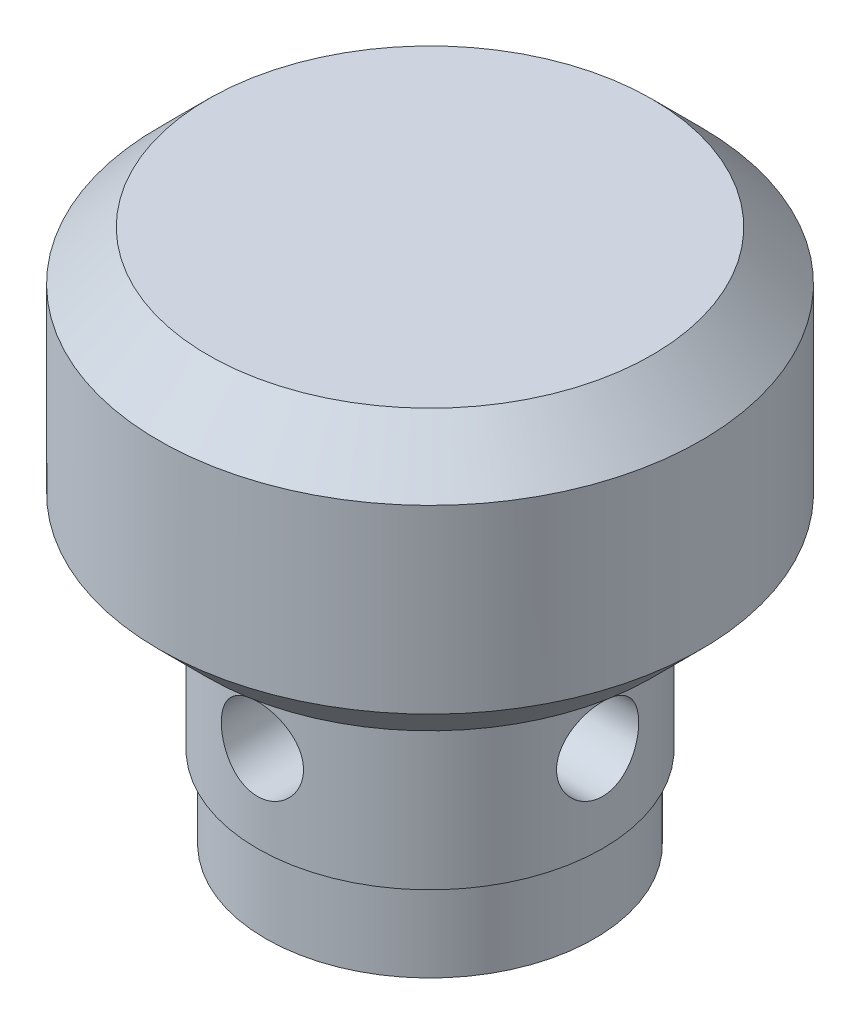
ISO-10303-21;
HEADER;
FILE_DESCRIPTION(('STEP AP214'),'2;1');
FILE_NAME('part.step','',(''),(''),'','','');
FILE_SCHEMA(('AUTOMOTIVE_DESIGN { 1 0 10303 214 1 1 1 1 }'));
ENDSEC;
DATA;
#1=APPLICATION_CONTEXT('core data for automotive mechanical design processes');
#2=APPLICATION_PROTOCOL_DEFINITION('international standard','automotive_design',2000,#1);
#3=PRODUCT_CONTEXT('',#1,'mechanical');
#4=PRODUCT('Part','Part','',(#3));
#5=PRODUCT_RELATED_PRODUCT_CATEGORY('part','',(#4));
#6=PRODUCT_DEFINITION_FORMATION('','',#4);
#7=PRODUCT_DEFINITION_CONTEXT('part definition',#1,'design');
#8=PRODUCT_DEFINITION('design','',#6,#7);
#9=PRODUCT_DEFINITION_SHAPE('','',#8);
#10=(LENGTH_UNIT() NAMED_UNIT(*) SI_UNIT(.MILLI.,.METRE.));
#11=(NAMED_UNIT(*) PLANE_ANGLE_UNIT() SI_UNIT($,.RADIAN.));
#12=(NAMED_UNIT(*) SI_UNIT($,.STERADIAN.) SOLID_ANGLE_UNIT());
#13=UNCERTAINTY_MEASURE_WITH_UNIT(LENGTH_MEASURE(1.E-05),#10,'distance_accuracy_value','');
#14=(GEOMETRIC_REPRESENTATION_CONTEXT(3) GLOBAL_UNCERTAINTY_ASSIGNED_CONTEXT((#13)) GLOBAL_UNIT_ASSIGNED_CONTEXT((#10,
#11,#12)) REPRESENTATION_CONTEXT('',''));
#15=CARTESIAN_POINT('',(0.,0.,0.));
#16=DIRECTION('',(0.,0.,1.));
#17=DIRECTION('',(1.,0.,0.));
#18=AXIS2_PLACEMENT_3D('',#15,#16,#17);
#19=CARTESIAN_POINT('',(0.,0.,0.));
#20=DIRECTION('',(0.,1.,0.));
#21=DIRECTION('',(0.,0.,1.));
#22=AXIS2_PLACEMENT_3D('',#19,#20,#21);
#23=PLANE('',#22);
#24=CARTESIAN_POINT('',(1.10727272727273,0.,-1.90909090909092));
#25=DIRECTION('',(0.,-1.,0.));
#26=DIRECTION('',(0.,0.,-1.));
#27=AXIS2_PLACEMENT_3D('',#24,#25,#26);
#28=CIRCLE('',#27,10.);
#29=CARTESIAN_POINT('',(1.10727272727273,0.,-11.9090909090909));
#30=VERTEX_POINT('',#29);
#31=EDGE_CURVE('E11',#30,#30,#28,.T.);
#32=ORIENTED_EDGE('',*,*,#31,.F.);
#33=EDGE_LOOP('',(#32));
#34=FACE_BOUND('',#33,.T.);
#35=CARTESIAN_POINT('',(1.10727272727273,0.,-1.90909090909092));
#36=DIRECTION('',(0.,1.,0.));
#37=DIRECTION('',(0.,0.,1.));
#38=AXIS2_PLACEMENT_3D('',#35,#36,#37);
#39=CIRCLE('',#38,10.5);
#40=CARTESIAN_POINT('',(1.10727272727273,0.,8.59090909090908));
#41=VERTEX_POINT('',#40);
#42=EDGE_CURVE('E170',#41,#41,#39,.T.);
#43=ORIENTED_EDGE('',*,*,#42,.F.);
#44=EDGE_LOOP('',(#43));
#45=FACE_BOUND('',#44,.T.);
#46=ADVANCED_FACE('F34',(#34,#45),#23,.F.);
#47=CARTESIAN_POINT('',(1.10727272727273,5.25,-15.9090909090909));
#48=DIRECTION('',(0.,0.,1.));
#49=DIRECTION('',(1.,0.,0.));
#50=AXIS2_PLACEMENT_3D('',#47,#48,#49);
#51=CYLINDRICAL_SURFACE('',#50,2.5);
#52=CARTESIAN_POINT('',(1.10727272727273,5.25,-1.90909090909092));
#53=DIRECTION('',(-0.707106781186547,0.,0.707106781186547));
#54=DIRECTION('',(0.707106781186547,0.,0.707106781186547));
#55=AXIS2_PLACEMENT_3D('',#52,#53,#54);
#56=ELLIPSE('',#55,3.53553390593274,2.5);
#57=CARTESIAN_POINT('',(1.10727272727273,7.75,-1.90909090909092));
#58=VERTEX_POINT('',#57);
#59=CARTESIAN_POINT('',(2.8750396802391,3.48223304703363,-0.141323956124547));
#60=VERTEX_POINT('',#59);
#61=EDGE_CURVE('E86',#58,#60,#56,.F.);
#62=ORIENTED_EDGE('',*,*,#61,.T.);
#63=CARTESIAN_POINT('',(1.10727272727273,5.25,-1.90909090909092));
#64=DIRECTION('',(0.,0.707106781186547,0.707106781186547));
#65=DIRECTION('',(0.,-0.707106781186547,0.707106781186547));
#66=AXIS2_PLACEMENT_3D('',#63,#64,#65);
#67=ELLIPSE('',#66,3.53553390593274,2.5);
#68=CARTESIAN_POINT('',(-0.660494225693643,3.48223304703363,-0.141323956124547));
#69=VERTEX_POINT('',#68);
#70=EDGE_CURVE('E50',#60,#69,#67,.F.);
#71=ORIENTED_EDGE('',*,*,#70,.T.);
#72=CARTESIAN_POINT('',(1.10727272727273,5.25,-1.90909090909092));
#73=DIRECTION('',(0.707106781186547,0.,0.707106781186547));
#74=DIRECTION('',(-0.707106781186547,0.,0.707106781186547));
#75=AXIS2_PLACEMENT_3D('',#72,#73,#74);
#76=ELLIPSE('',#75,3.53553390593274,2.5);
#77=EDGE_CURVE('E57',#69,#58,#76,.F.);
#78=ORIENTED_EDGE('',*,*,#77,.T.);
#79=EDGE_LOOP('',(#62,#71,#78));
#80=FACE_BOUND('',#79,.T.);
#81=CARTESIAN_POINT('',(1.10727272727273,7.75,8.59090909090908));
#82=CARTESIAN_POINT('',(1.24545276969234,7.74999304002521,8.59090520188962));
#83=CARTESIAN_POINT('',(1.38379765625235,7.73849338058383,8.58815102276378));
#84=CARTESIAN_POINT('',(1.65665655177706,7.69282235918726,8.57741980260843));
#85=CARTESIAN_POINT('',(1.79116273989071,7.65860774049447,8.56943279694204));
#86=CARTESIAN_POINT('',(2.05218387770887,7.56865434806554,8.54912359354954));
#87=CARTESIAN_POINT('',(2.17871153013522,7.5129508480802,8.536808503257));
#88=CARTESIAN_POINT('',(2.42058336346318,7.3817015965446,8.50916482801384));
#89=CARTESIAN_POINT('',(2.53593062628848,7.30616133450388,8.49383707706402));
#90=CARTESIAN_POINT('',(2.75439919018182,7.13586300980744,8.46151124578841));
#91=CARTESIAN_POINT('',(2.85727941302636,7.0408001772292,8.44448920659301));
#92=CARTESIAN_POINT('',(3.04580194081693,6.83480390511333,8.41085559593251));
#93=CARTESIAN_POINT('',(3.13144152924257,6.72386796923391,8.39424408951416));
#94=CARTESIAN_POINT('',(3.28414189177027,6.48745704404985,8.36307606961005));
#95=CARTESIAN_POINT('',(3.35094036031321,6.36180827626745,8.348549832948));
#96=CARTESIAN_POINT('',(3.46237639131847,6.1006653055624,8.32354171402451));
#97=CARTESIAN_POINT('',(3.50701731440505,5.96517259924094,8.31305921850456));
#98=CARTESIAN_POINT('',(3.57206509617649,5.69080620111243,8.29756901614652));
#99=CARTESIAN_POINT('',(3.59289991832407,5.552039546202,8.29246475958853));
#100=CARTESIAN_POINT('',(3.61107620490725,5.27289368396075,8.28801959431932));
#101=CARTESIAN_POINT('',(3.60842108585323,5.13251471410029,8.28867784747583));
#102=CARTESIAN_POINT('',(3.58003553336417,4.8573708098123,8.29559627423961));
#103=CARTESIAN_POINT('',(3.55481009468411,4.72255021833167,8.30173384536311));
#104=CARTESIAN_POINT('',(3.4828030418247,4.45911062358124,8.31872465730834));
#105=CARTESIAN_POINT('',(3.4360198724614,4.3304920684686,8.32957823834183));
#106=CARTESIAN_POINT('',(3.32178038124929,4.0817250195944,8.35489430310446));
#107=CARTESIAN_POINT('',(3.25413590374933,3.96166638959504,8.36938940085652));
#108=CARTESIAN_POINT('',(3.10023072353306,3.73442907232009,8.40033495597346));
#109=CARTESIAN_POINT('',(3.01396832155568,3.62725156209747,8.41678559175901));
#110=CARTESIAN_POINT('',(2.82265369147607,3.42592763687392,8.4503067348457));
#111=CARTESIAN_POINT('',(2.7171770347683,3.33218498301948,8.46738233066638));
#112=CARTESIAN_POINT('',(2.49174965557243,3.16360710362831,8.49985576501045));
#113=CARTESIAN_POINT('',(2.37179271665111,3.0887800415762,8.5152528775186));
#114=CARTESIAN_POINT('',(2.12023348001323,2.96003115061365,8.54270195971719));
#115=CARTESIAN_POINT('',(1.98859034100088,2.9061864909642,8.55474153573935));
#116=CARTESIAN_POINT('',(1.71793467371349,2.82160257063129,8.57400953315034));
#117=CARTESIAN_POINT('',(1.57893818100403,2.79081508584319,8.58124799243104));
#118=CARTESIAN_POINT('',(1.3835610557936,2.76469448646472,8.58741856007436));
#119=CARTESIAN_POINT('',(1.32846340055401,2.75918921958083,8.58872436332062));
#120=CARTESIAN_POINT('',(1.21801023304312,2.75184057766675,8.59047040901537));
#121=CARTESIAN_POINT('',(1.16265472022042,2.74999721047071,8.5909106496121));
#122=CARTESIAN_POINT('',(0.969092684853115,2.75000695997477,8.59090520188962));
#123=CARTESIAN_POINT('',(0.830747798293107,2.76150661941617,8.58815102276378));
#124=CARTESIAN_POINT('',(0.5578889027684,2.80717764081275,8.57741980260843));
#125=CARTESIAN_POINT('',(0.42338271465474,2.84139225950553,8.56943279694204));
#126=CARTESIAN_POINT('',(0.162361576836585,2.93134565193446,8.54912359354954));
#127=CARTESIAN_POINT('',(0.0358339244102344,2.9870491519198,8.536808503257));
#128=CARTESIAN_POINT('',(-0.206037908917726,3.1182984034554,8.50916482801384));
#129=CARTESIAN_POINT('',(-0.321385171743029,3.19383866549612,8.49383707706402));
#130=CARTESIAN_POINT('',(-0.539853735636368,3.36413699019257,8.46151124578841));
#131=CARTESIAN_POINT('',(-0.642733958480909,3.4591998227708,8.44448920659301));
#132=CARTESIAN_POINT('',(-0.831256486271477,3.66519609488668,8.41085559593251));
#133=CARTESIAN_POINT('',(-0.916896074697116,3.77613203076609,8.39424408951416));
#134=CARTESIAN_POINT('',(-1.06959643722482,4.01254295595016,8.36307606961005));
#135=CARTESIAN_POINT('',(-1.13639490576775,4.13819172373255,8.348549832948));
#136=CARTESIAN_POINT('',(-1.24783093677302,4.3993346944376,8.32354171402451));
#137=CARTESIAN_POINT('',(-1.2924718598596,4.53482740075906,8.31305921850456));
#138=CARTESIAN_POINT('',(-1.35751964163104,4.80919379888757,8.29756901614652));
#139=CARTESIAN_POINT('',(-1.37835446377862,4.947960453798,8.29246475958853));
#140=CARTESIAN_POINT('',(-1.3965307503618,5.22710631603925,8.28801959431932));
#141=CARTESIAN_POINT('',(-1.39387563130778,5.36748528589972,8.28867784747583));
#142=CARTESIAN_POINT('',(-1.36549007881872,5.6426291901877,8.29559627423961));
#143=CARTESIAN_POINT('',(-1.34026464013866,5.77744978166833,8.30173384536311));
#144=CARTESIAN_POINT('',(-1.26825758727925,6.04088937641876,8.31872465730834));
#145=CARTESIAN_POINT('',(-1.22147441791595,6.1695079315314,8.32957823834183));
#146=CARTESIAN_POINT('',(-1.10723492670384,6.41827498040561,8.35489430310445));
#147=CARTESIAN_POINT('',(-1.03959044920388,6.53833361040496,8.36938940085652));
#148=CARTESIAN_POINT('',(-0.885685268987606,6.76557092767991,8.40033495597346));
#149=CARTESIAN_POINT('',(-0.799422867010227,6.87274843790253,8.41678559175901));
#150=CARTESIAN_POINT('',(-0.608108236930619,7.07407236312608,8.4503067348457));
#151=CARTESIAN_POINT('',(-0.502631580222855,7.16781501698052,8.46738233066638));
#152=CARTESIAN_POINT('',(-0.277204201026979,7.33639289637169,8.49985576501045));
#153=CARTESIAN_POINT('',(-0.157247262105656,7.4112199584238,8.5152528775186));
#154=CARTESIAN_POINT('',(0.0943119745322204,7.53996884938636,8.54270195971719));
#155=CARTESIAN_POINT('',(0.225955113544568,7.59381350903581,8.55474153573935));
#156=CARTESIAN_POINT('',(0.496610780831966,7.67839742936871,8.57400953315034));
#157=CARTESIAN_POINT('',(0.635607273541422,7.70918491415681,8.58124799243104));
#158=CARTESIAN_POINT('',(0.830984398751849,7.73530551353528,8.58741856007436));
#159=CARTESIAN_POINT('',(0.886082053991438,7.74081078041918,8.58872436332062));
#160=CARTESIAN_POINT('',(0.996535221502329,7.74815942233325,8.59047040901537));
#161=CARTESIAN_POINT('',(1.05189073432503,7.75000278952929,8.59091064961209));
#162=CARTESIAN_POINT('',(1.10727272727273,7.75,8.59090909090908));
#163=B_SPLINE_CURVE_WITH_KNOTS('',3,(#81,#82,#83,#84,#85,#86,#87,#88,#89,#90,#91,#92,#93,#94,
#95,#96,#97,#98,#99,#100,#101,#102,#103,#104,#105,#106,#107,#108,#109,#110,#111,#112,#113,#114,
#115,#116,#117,#118,#119,#120,#121,#122,#123,#124,#125,#126,#127,#128,#129,#130,#131,#132,#133,
#134,#135,#136,#137,#138,#139,#140,#141,#142,#143,#144,#145,#146,#147,#148,#149,#150,#151,#152,
#153,#154,#155,#156,#157,#158,#159,#160,#161,#162),.UNSPECIFIED.,.T.,.F.,(4,2,2,2,2,2,2,2,2,2,2,
2,2,2,2,2,2,2,2,2,2,2,2,2,2,2,2,2,2,2,2,2,2,2,2,2,2,2,2,2,4),(0.,0.414327933907577,
0.829447156123724,1.24388784463687,1.65821396390004,2.07958110010318,2.50101457714032,
2.9280543023058,3.35502923875525,3.77420130428169,4.19331240404604,4.6032743925737,
5.01326596056668,5.42706924125843,5.84091030582799,6.26534403127582,6.68996061991559,
7.11612445167521,7.54139445284958,7.70745503020584,7.87351596282606,8.28784389673364,
8.70296311894979,9.11740380746294,9.5317299267261,9.95309706292924,10.3745305399664,
10.8015702651319,11.2285452015813,11.6477172671078,12.0668283668721,12.4767903553998,
12.8867819233927,13.3005852040845,13.714426268654,14.1388599941019,14.5634765827417,
14.9896404145013,15.4149104156756,15.5809709930319,15.7470319256521),.UNSPECIFIED.);
#164=CARTESIAN_POINT('',(1.10727272727273,7.75,8.59090909090908));
#165=VERTEX_POINT('',#164);
#166=EDGE_CURVE('E125',#165,#165,#163,.T.);
#167=ORIENTED_EDGE('',*,*,#166,.F.);
#168=EDGE_LOOP('',(#167));
#169=FACE_BOUND('',#168,.T.);
#170=ADVANCED_FACE('F130',(#80,#169),#51,.F.);
#171=CARTESIAN_POINT('',(15.1072727272727,5.25,-1.90909090909092));
#172=DIRECTION('',(-1.,0.,0.));
#173=DIRECTION('',(0.,0.,1.));
#174=AXIS2_PLACEMENT_3D('',#171,#172,#173);
#175=CYLINDRICAL_SURFACE('',#174,2.5);
#176=ORIENTED_EDGE('',*,*,#77,.F.);
#177=CARTESIAN_POINT('',(1.10727272727273,5.25,-1.90909090909092));
#178=DIRECTION('',(-0.707106781186547,0.707106781186547,0.));
#179=DIRECTION('',(-0.707106781186547,-0.707106781186547,0.));
#180=AXIS2_PLACEMENT_3D('',#177,#178,#179);
#181=ELLIPSE('',#180,3.53553390593274,2.5);
#182=CARTESIAN_POINT('',(-0.660494225693643,3.48223304703363,-3.67685786205728));
#183=VERTEX_POINT('',#182);
#184=EDGE_CURVE('E82',#69,#183,#181,.F.);
#185=ORIENTED_EDGE('',*,*,#184,.T.);
#186=CARTESIAN_POINT('',(1.10727272727273,5.25,-1.90909090909092));
#187=DIRECTION('',(-0.707106781186547,0.,0.707106781186547));
#188=DIRECTION('',(0.707106781186547,0.,0.707106781186547));
#189=AXIS2_PLACEMENT_3D('',#186,#187,#188);
#190=ELLIPSE('',#189,3.53553390593274,2.5);
#191=EDGE_CURVE('E81',#58,#183,#190,.T.);
#192=ORIENTED_EDGE('',*,*,#191,.F.);
#193=EDGE_LOOP('',(#176,#185,#192));
#194=FACE_BOUND('',#193,.T.);
#195=CARTESIAN_POINT('',(-9.39272727272727,2.75,-1.90909090909092));
#196=CARTESIAN_POINT('',(-9.39272338370781,2.7500069599748,-2.04727095151053));
#197=CARTESIAN_POINT('',(-9.38996920458197,2.76150661941618,-2.18561583807054));
#198=CARTESIAN_POINT('',(-9.37923798442662,2.80717764081274,-2.45847473359525));
#199=CARTESIAN_POINT('',(-9.37125097876023,2.84139225950553,-2.59298092170891));
#200=CARTESIAN_POINT('',(-9.35094177536773,2.93134565193446,-2.85400205952706));
#201=CARTESIAN_POINT('',(-9.33862668507519,2.9870491519198,-2.98052971195341));
#202=CARTESIAN_POINT('',(-9.31098300983203,3.1182984034554,-3.22240154528137));
#203=CARTESIAN_POINT('',(-9.29565525888221,3.19383866549612,-3.33774880810667));
#204=CARTESIAN_POINT('',(-9.26332942760659,3.36413699019257,-3.55621737200001));
#205=CARTESIAN_POINT('',(-9.2463073884112,3.45919982277081,-3.65909759484455));
#206=CARTESIAN_POINT('',(-9.21267377775071,3.66519609488668,-3.84762012263512));
#207=CARTESIAN_POINT('',(-9.19606227133235,3.77613203076609,-3.93325971106076));
#208=CARTESIAN_POINT('',(-9.16489425142823,4.01254295595016,-4.08596007358846));
#209=CARTESIAN_POINT('',(-9.15036801476618,4.13819172373255,-4.1527585421314));
#210=CARTESIAN_POINT('',(-9.1253598958427,4.3993346944376,-4.26419457313666));
#211=CARTESIAN_POINT('',(-9.11487740032275,4.53482740075907,-4.30883549622324));
#212=CARTESIAN_POINT('',(-9.09938719796471,4.80919379888758,-4.37388327799468));
#213=CARTESIAN_POINT('',(-9.09428294140672,4.94796045379801,-4.39471810014227));
#214=CARTESIAN_POINT('',(-9.08983777613751,5.22710631603926,-4.41289438672545));
#215=CARTESIAN_POINT('',(-9.09049602929402,5.36748528589972,-4.41023926767142));
#216=CARTESIAN_POINT('',(-9.0974144560578,5.6426291901877,-4.38185371518236));
#217=CARTESIAN_POINT('',(-9.1035520271813,5.77744978166833,-4.3566282765023));
#218=CARTESIAN_POINT('',(-9.12054283912653,6.04088937641876,-4.28462122364289));
#219=CARTESIAN_POINT('',(-9.13139642016002,6.16950793153141,-4.23783805427959));
#220=CARTESIAN_POINT('',(-9.15671248492264,6.41827498040561,-4.12359856306748));
#221=CARTESIAN_POINT('',(-9.17120758267471,6.53833361040496,-4.05595408556752));
#222=CARTESIAN_POINT('',(-9.20215313779165,6.76557092767992,-3.90204890535125));
#223=CARTESIAN_POINT('',(-9.2186037735772,6.87274843790254,-3.81578650337387));
#224=CARTESIAN_POINT('',(-9.25212491666389,7.07407236312609,-3.62447187329426));
#225=CARTESIAN_POINT('',(-9.26920051248457,7.16781501698052,-3.51899521658649));
#226=CARTESIAN_POINT('',(-9.30167394682864,7.33639289637169,-3.29356783739062));
#227=CARTESIAN_POINT('',(-9.31707105933679,7.4112199584238,-3.1736108984693));
#228=CARTESIAN_POINT('',(-9.34452014153538,7.53996884938636,-2.92205166183142));
#229=CARTESIAN_POINT('',(-9.35655971755754,7.59381350903581,-2.79040852281907));
#230=CARTESIAN_POINT('',(-9.37582771496853,7.67839742936871,-2.51975285553168));
#231=CARTESIAN_POINT('',(-9.38306617424922,7.70918491415681,-2.38075636282222));
#232=CARTESIAN_POINT('',(-9.38923674189255,7.73530551353528,-2.18537923761179));
#233=CARTESIAN_POINT('',(-9.39054254513881,7.74081078041918,-2.1302815823722));
#234=CARTESIAN_POINT('',(-9.39228859083356,7.74815942233326,-2.01982841486132));
#235=CARTESIAN_POINT('',(-9.39272883143029,7.7500027895293,-1.96447290203862));
#236=CARTESIAN_POINT('',(-9.39272338370781,7.74999304002523,-1.77091086667131));
#237=CARTESIAN_POINT('',(-9.38996920458197,7.73849338058384,-1.6325659801113));
#238=CARTESIAN_POINT('',(-9.37923798442662,7.69282235918726,-1.35970708458659));
#239=CARTESIAN_POINT('',(-9.37125097876023,7.65860774049447,-1.22520089647293));
#240=CARTESIAN_POINT('',(-9.35094177536773,7.56865434806555,-0.964179758654776));
#241=CARTESIAN_POINT('',(-9.33862668507519,7.51295084808021,-0.837652106228425));
#242=CARTESIAN_POINT('',(-9.31098300983202,7.3817015965446,-0.595780272900465));
#243=CARTESIAN_POINT('',(-9.29565525888221,7.30616133450389,-0.480433010075162));
#244=CARTESIAN_POINT('',(-9.26332942760659,7.13586300980744,-0.261964446181823));
#245=CARTESIAN_POINT('',(-9.2463073884112,7.0408001772292,-0.159084223337281));
#246=CARTESIAN_POINT('',(-9.2126737777507,6.83480390511333,0.0294383044532865));
#247=CARTESIAN_POINT('',(-9.19606227133235,6.72386796923391,0.115077892878925));
#248=CARTESIAN_POINT('',(-9.16489425142824,6.48745704404985,0.267778255406628));
#249=CARTESIAN_POINT('',(-9.15036801476619,6.36180827626746,0.334576723949563));
#250=CARTESIAN_POINT('',(-9.1253598958427,6.1006653055624,0.446012754954827));
#251=CARTESIAN_POINT('',(-9.11487740032276,5.96517259924094,0.49065367804141));
#252=CARTESIAN_POINT('',(-9.09938719796471,5.69080620111243,0.55570145981285));
#253=CARTESIAN_POINT('',(-9.09428294140672,5.552039546202,0.576536281960433));
#254=CARTESIAN_POINT('',(-9.08983777613751,5.27289368396075,0.594712568543613));
#255=CARTESIAN_POINT('',(-9.09049602929402,5.13251471410029,0.592057449489592));
#256=CARTESIAN_POINT('',(-9.0974144560578,4.85737080981231,0.56367189700053));
#257=CARTESIAN_POINT('',(-9.1035520271813,4.72255021833167,0.538446458320467));
#258=CARTESIAN_POINT('',(-9.12054283912653,4.45911062358124,0.46643940546106));
#259=CARTESIAN_POINT('',(-9.13139642016002,4.3304920684686,0.419656236097755));
#260=CARTESIAN_POINT('',(-9.15671248492264,4.0817250195944,0.305416744885646));
#261=CARTESIAN_POINT('',(-9.17120758267471,3.96166638959505,0.237772267385687));
#262=CARTESIAN_POINT('',(-9.20215313779165,3.73442907232009,0.083867087169418));
#263=CARTESIAN_POINT('',(-9.2186037735772,3.62725156209747,-0.00239531480796155));
#264=CARTESIAN_POINT('',(-9.25212491666389,3.42592763687392,-0.19370994488757));
#265=CARTESIAN_POINT('',(-9.26920051248457,3.33218498301949,-0.299186601595335));
#266=CARTESIAN_POINT('',(-9.30167394682864,3.16360710362831,-0.524613980791211));
#267=CARTESIAN_POINT('',(-9.31707105933679,3.08878004157621,-0.644570919712533));
#268=CARTESIAN_POINT('',(-9.34452014153538,2.96003115061365,-0.896130156350408));
#269=CARTESIAN_POINT('',(-9.35655971755754,2.9061864909642,-1.02777329536276));
#270=CARTESIAN_POINT('',(-9.37582771496852,2.8216025706313,-1.29842896265015));
#271=CARTESIAN_POINT('',(-9.38306617424922,2.79081508584319,-1.43742545535961));
#272=CARTESIAN_POINT('',(-9.38923674189255,2.76469448646472,-1.63280258057004));
#273=CARTESIAN_POINT('',(-9.39054254513881,2.75918921958083,-1.68790023580963));
#274=CARTESIAN_POINT('',(-9.39228859083356,2.75184057766675,-1.79835340332052));
#275=CARTESIAN_POINT('',(-9.39272883143028,2.74999721047072,-1.85370891614322));
#276=CARTESIAN_POINT('',(-9.39272727272727,2.75,-1.90909090909092));
#277=B_SPLINE_CURVE_WITH_KNOTS('',3,(#195,#196,#197,#198,#199,#200,#201,#202,#203,#204,#205,
#206,#207,#208,#209,#210,#211,#212,#213,#214,#215,#216,#217,#218,#219,#220,#221,#222,#223,#224,
#225,#226,#227,#228,#229,#230,#231,#232,#233,#234,#235,#236,#237,#238,#239,#240,#241,#242,#243,
#244,#245,#246,#247,#248,#249,#250,#251,#252,#253,#254,#255,#256,#257,#258,#259,#260,#261,#262,
#263,#264,#265,#266,#267,#268,#269,#270,#271,#272,#273,#274,#275,#276),.UNSPECIFIED.,.T.,.F.,(4,
2,2,2,2,2,2,2,2,2,2,2,2,2,2,2,2,2,2,2,2,2,2,2,2,2,2,2,2,2,2,2,2,2,2,2,2,2,2,2,4),(0.,
0.414327933907577,0.829447156123724,1.24388784463687,1.65821396390004,2.07958110010318,
2.50101457714032,2.9280543023058,3.35502923875525,3.7742013042817,4.19331240404604,
4.6032743925737,5.01326596056668,5.42706924125843,5.84091030582799,6.26534403127582,
6.68996061991559,7.11612445167521,7.54139445284958,7.70745503020584,7.87351596282606,
8.28784389673364,8.70296311894979,9.11740380746294,9.5317299267261,9.95309706292924,
10.3745305399664,10.8015702651319,11.2285452015813,11.6477172671078,12.0668283668721,
12.4767903553998,12.8867819233927,13.3005852040845,13.7144262686541,14.1388599941019,
14.5634765827417,14.9896404145013,15.4149104156756,15.5809709930319,15.7470319256521),.UNSPECIFIED.);
#278=CARTESIAN_POINT('',(-9.39272727272727,2.75,-1.90909090909092));
#279=VERTEX_POINT('',#278);
#280=EDGE_CURVE('E102',#279,#279,#277,.T.);
#281=ORIENTED_EDGE('',*,*,#280,.F.);
#282=EDGE_LOOP('',(#281));
#283=FACE_BOUND('',#282,.T.);
#284=ADVANCED_FACE('F107',(#194,#283),#175,.F.);
#285=ORIENTED_EDGE('',*,*,#191,.T.);
#286=CARTESIAN_POINT('',(1.10727272727273,5.25,-1.90909090909092));
#287=DIRECTION('',(0.,-0.707106781186547,0.707106781186547));
#288=DIRECTION('',(0.,0.707106781186547,0.707106781186547));
#289=AXIS2_PLACEMENT_3D('',#286,#287,#288);
#290=ELLIPSE('',#289,3.53553390593274,2.5);
#291=CARTESIAN_POINT('',(2.87503968023909,3.48223304703363,-3.67685786205729));
#292=VERTEX_POINT('',#291);
#293=EDGE_CURVE('E68',#183,#292,#290,.T.);
#294=ORIENTED_EDGE('',*,*,#293,.T.);
#295=CARTESIAN_POINT('',(1.10727272727273,5.25,-1.90909090909092));
#296=DIRECTION('',(0.707106781186547,0.,0.707106781186547));
#297=DIRECTION('',(-0.707106781186547,0.,0.707106781186547));
#298=AXIS2_PLACEMENT_3D('',#295,#296,#297);
#299=ELLIPSE('',#298,3.53553390593274,2.5);
#300=EDGE_CURVE('E79',#292,#58,#299,.T.);
#301=ORIENTED_EDGE('',*,*,#300,.T.);
#302=EDGE_LOOP('',(#285,#294,#301));
#303=FACE_BOUND('',#302,.T.);
#304=CARTESIAN_POINT('',(1.10727272727273,7.75,-12.4090909090909));
#305=CARTESIAN_POINT('',(0.969092684853114,7.74999304002521,-12.4090870200714));
#306=CARTESIAN_POINT('',(0.830747798293105,7.73849338058383,-12.4063328409456));
#307=CARTESIAN_POINT('',(0.557888902768399,7.69282235918726,-12.3956016207903));
#308=CARTESIAN_POINT('',(0.42338271465474,7.65860774049447,-12.3876146151239));
#309=CARTESIAN_POINT('',(0.162361576836587,7.56865434806555,-12.3673054117314));
#310=CARTESIAN_POINT('',(0.035833924410236,7.51295084808021,-12.3549903214388));
#311=CARTESIAN_POINT('',(-0.206037908917725,7.38170159654461,-12.3273466461957));
#312=CARTESIAN_POINT('',(-0.321385171743028,7.30616133450389,-12.3120188952459));
#313=CARTESIAN_POINT('',(-0.539853735636368,7.13586300980744,-12.2796930639702));
#314=CARTESIAN_POINT('',(-0.64273395848091,7.0408001772292,-12.2626710247748));
#315=CARTESIAN_POINT('',(-0.831256486271477,6.83480390511333,-12.2290374141143));
#316=CARTESIAN_POINT('',(-0.916896074697116,6.72386796923391,-12.212425907696));
#317=CARTESIAN_POINT('',(-1.06959643722482,6.48745704404985,-12.1812578877919));
#318=CARTESIAN_POINT('',(-1.13639490576775,6.36180827626746,-12.1667316511298));
#319=CARTESIAN_POINT('',(-1.24783093677302,6.1006653055624,-12.1417235322063));
#320=CARTESIAN_POINT('',(-1.2924718598596,5.96517259924094,-12.1312410366864));
#321=CARTESIAN_POINT('',(-1.35751964163104,5.69080620111243,-12.1157508343284));
#322=CARTESIAN_POINT('',(-1.37835446377862,5.552039546202,-12.1106465777704));
#323=CARTESIAN_POINT('',(-1.3965307503618,5.27289368396075,-12.1062014125012));
#324=CARTESIAN_POINT('',(-1.39387563130778,5.13251471410029,-12.1068596656577));
#325=CARTESIAN_POINT('',(-1.36549007881872,4.85737080981231,-12.1137780924214));
#326=CARTESIAN_POINT('',(-1.34026464013866,4.72255021833167,-12.1199156635449));
#327=CARTESIAN_POINT('',(-1.26825758727925,4.45911062358125,-12.1369064754902));
#328=CARTESIAN_POINT('',(-1.22147441791595,4.3304920684686,-12.1477600565237));
#329=CARTESIAN_POINT('',(-1.10723492670384,4.0817250195944,-12.1730761212863));
#330=CARTESIAN_POINT('',(-1.03959044920388,3.96166638959505,-12.1875712190384));
#331=CARTESIAN_POINT('',(-0.885685268987608,3.73442907232009,-12.2185167741553));
#332=CARTESIAN_POINT('',(-0.799422867010229,3.62725156209747,-12.2349674099408));
#333=CARTESIAN_POINT('',(-0.60810823693062,3.42592763687392,-12.2684885530275));
#334=CARTESIAN_POINT('',(-0.502631580222855,3.33218498301949,-12.2855641488482));
#335=CARTESIAN_POINT('',(-0.277204201026979,3.16360710362831,-12.3180375831923));
#336=CARTESIAN_POINT('',(-0.157247262105657,3.08878004157621,-12.3334346957004));
#337=CARTESIAN_POINT('',(0.0943119745322176,2.96003115061365,-12.360883777899));
#338=CARTESIAN_POINT('',(0.225955113544564,2.9061864909642,-12.3729233539212));
#339=CARTESIAN_POINT('',(0.496610780831962,2.8216025706313,-12.3921913513322));
#340=CARTESIAN_POINT('',(0.63560727354142,2.79081508584319,-12.3994298106129));
#341=CARTESIAN_POINT('',(0.830984398751848,2.76469448646472,-12.4056003782562));
#342=CARTESIAN_POINT('',(0.886082053991437,2.75918921958083,-12.4069061815025));
#343=CARTESIAN_POINT('',(0.996535221502328,2.75184057766675,-12.4086522271972));
#344=CARTESIAN_POINT('',(1.05189073432503,2.74999721047071,-12.4090924677939));
#345=CARTESIAN_POINT('',(1.24545276969234,2.75000695997477,-12.4090870200715));
#346=CARTESIAN_POINT('',(1.38379765625235,2.76150661941617,-12.4063328409456));
#347=CARTESIAN_POINT('',(1.65665655177705,2.80717764081275,-12.3956016207903));
#348=CARTESIAN_POINT('',(1.79116273989071,2.84139225950553,-12.3876146151239));
#349=CARTESIAN_POINT('',(2.05218387770887,2.93134565193446,-12.3673054117314));
#350=CARTESIAN_POINT('',(2.17871153013522,2.9870491519198,-12.3549903214388));
#351=CARTESIAN_POINT('',(2.42058336346318,3.1182984034554,-12.3273466461957));
#352=CARTESIAN_POINT('',(2.53593062628848,3.19383866549612,-12.3120188952459));
#353=CARTESIAN_POINT('',(2.75439919018182,3.36413699019257,-12.2796930639702));
#354=CARTESIAN_POINT('',(2.85727941302636,3.45919982277081,-12.2626710247748));
#355=CARTESIAN_POINT('',(3.04580194081693,3.66519609488668,-12.2290374141143));
#356=CARTESIAN_POINT('',(3.13144152924257,3.77613203076609,-12.212425907696));
#357=CARTESIAN_POINT('',(3.28414189177027,4.01254295595016,-12.1812578877919));
#358=CARTESIAN_POINT('',(3.35094036031321,4.13819172373255,-12.1667316511298));
#359=CARTESIAN_POINT('',(3.46237639131847,4.3993346944376,-12.1417235322063));
#360=CARTESIAN_POINT('',(3.50701731440505,4.53482740075907,-12.1312410366864));
#361=CARTESIAN_POINT('',(3.57206509617649,4.80919379888758,-12.1157508343284));
#362=CARTESIAN_POINT('',(3.59289991832407,4.94796045379801,-12.1106465777704));
#363=CARTESIAN_POINT('',(3.61107620490725,5.22710631603926,-12.1062014125012));
#364=CARTESIAN_POINT('',(3.60842108585323,5.36748528589972,-12.1068596656577));
#365=CARTESIAN_POINT('',(3.58003553336417,5.6426291901877,-12.1137780924214));
#366=CARTESIAN_POINT('',(3.55481009468411,5.77744978166833,-12.1199156635449));
#367=CARTESIAN_POINT('',(3.4828030418247,6.04088937641876,-12.1369064754902));
#368=CARTESIAN_POINT('',(3.4360198724614,6.1695079315314,-12.1477600565237));
#369=CARTESIAN_POINT('',(3.32178038124929,6.41827498040561,-12.1730761212863));
#370=CARTESIAN_POINT('',(3.25413590374933,6.53833361040496,-12.1875712190384));
#371=CARTESIAN_POINT('',(3.10023072353306,6.76557092767992,-12.2185167741553));
#372=CARTESIAN_POINT('',(3.01396832155568,6.87274843790254,-12.2349674099408));
#373=CARTESIAN_POINT('',(2.82265369147607,7.07407236312609,-12.2684885530275));
#374=CARTESIAN_POINT('',(2.7171770347683,7.16781501698052,-12.2855641488482));
#375=CARTESIAN_POINT('',(2.49174965557243,7.33639289637169,-12.3180375831923));
#376=CARTESIAN_POINT('',(2.37179271665111,7.4112199584238,-12.3334346957004));
#377=CARTESIAN_POINT('',(2.12023348001323,7.53996884938636,-12.360883777899));
#378=CARTESIAN_POINT('',(1.98859034100088,7.59381350903581,-12.3729233539212));
#379=CARTESIAN_POINT('',(1.71793467371349,7.67839742936871,-12.3921913513322));
#380=CARTESIAN_POINT('',(1.57893818100403,7.70918491415681,-12.3994298106129));
#381=CARTESIAN_POINT('',(1.3835610557936,7.73530551353528,-12.4056003782562));
#382=CARTESIAN_POINT('',(1.32846340055401,7.74081078041918,-12.4069061815025));
#383=CARTESIAN_POINT('',(1.21801023304312,7.74815942233325,-12.4086522271972));
#384=CARTESIAN_POINT('',(1.16265472022042,7.75000278952929,-12.4090924677939));
#385=CARTESIAN_POINT('',(1.10727272727273,7.75,-12.4090909090909));
#386=B_SPLINE_CURVE_WITH_KNOTS('',3,(#304,#305,#306,#307,#308,#309,#310,#311,#312,#313,#314,
#315,#316,#317,#318,#319,#320,#321,#322,#323,#324,#325,#326,#327,#328,#329,#330,#331,#332,#333,
#334,#335,#336,#337,#338,#339,#340,#341,#342,#343,#344,#345,#346,#347,#348,#349,#350,#351,#352,
#353,#354,#355,#356,#357,#358,#359,#360,#361,#362,#363,#364,#365,#366,#367,#368,#369,#370,#371,
#372,#373,#374,#375,#376,#377,#378,#379,#380,#381,#382,#383,#384,#385),.UNSPECIFIED.,.T.,.F.,(4,
2,2,2,2,2,2,2,2,2,2,2,2,2,2,2,2,2,2,2,2,2,2,2,2,2,2,2,2,2,2,2,2,2,2,2,2,2,2,2,4),(0.,
0.414327933907577,0.829447156123724,1.24388784463687,1.65821396390004,2.07958110010318,
2.50101457714032,2.9280543023058,3.35502923875525,3.77420130428169,4.19331240404604,
4.6032743925737,5.01326596056668,5.42706924125843,5.84091030582799,6.26534403127582,
6.68996061991559,7.11612445167521,7.54139445284958,7.70745503020584,7.87351596282607,
8.28784389673364,8.70296311894979,9.11740380746294,9.53172992672611,9.95309706292925,
10.3745305399664,10.8015702651319,11.2285452015813,11.6477172671078,12.0668283668721,
12.4767903553998,12.8867819233927,13.3005852040845,13.7144262686541,14.1388599941019,
14.5634765827417,14.9896404145013,15.4149104156756,15.5809709930319,15.7470319256521),.UNSPECIFIED.);
#387=CARTESIAN_POINT('',(1.10727272727273,7.75,-12.4090909090909));
#388=VERTEX_POINT('',#387);
#389=EDGE_CURVE('E89',#388,#388,#386,.T.);
#390=ORIENTED_EDGE('',*,*,#389,.F.);
#391=EDGE_LOOP('',(#390));
#392=FACE_BOUND('',#391,.T.);
#393=ADVANCED_FACE('F77',(#303,#392),#51,.F.);
#394=ORIENTED_EDGE('',*,*,#300,.F.);
#395=CARTESIAN_POINT('',(1.10727272727273,5.25,-1.90909090909092));
#396=DIRECTION('',(-0.707106781186547,-0.707106781186547,0.));
#397=DIRECTION('',(-0.707106781186547,0.707106781186547,0.));
#398=AXIS2_PLACEMENT_3D('',#395,#396,#397);
#399=ELLIPSE('',#398,3.53553390593274,2.5);
#400=EDGE_CURVE('E65',#292,#60,#399,.T.);
#401=ORIENTED_EDGE('',*,*,#400,.T.);
#402=ORIENTED_EDGE('',*,*,#61,.F.);
#403=EDGE_LOOP('',(#394,#401,#402));
#404=FACE_BOUND('',#403,.T.);
#405=CARTESIAN_POINT('',(11.6072727272727,2.75,-1.90909090909092));
#406=CARTESIAN_POINT('',(11.6072688382533,2.7500069599748,-1.7709108666713));
#407=CARTESIAN_POINT('',(11.6045146591274,2.76150661941618,-1.63256598011129));
#408=CARTESIAN_POINT('',(11.5937834389721,2.80717764081274,-1.35970708458659));
#409=CARTESIAN_POINT('',(11.5857964333057,2.84139225950553,-1.22520089647293));
#410=CARTESIAN_POINT('',(11.5654872299132,2.93134565193446,-0.964179758654774));
#411=CARTESIAN_POINT('',(11.5531721396206,2.9870491519198,-0.837652106228424));
#412=CARTESIAN_POINT('',(11.5255284643775,3.1182984034554,-0.595780272900463));
#413=CARTESIAN_POINT('',(11.5102007134277,3.19383866549612,-0.480433010075161));
#414=CARTESIAN_POINT('',(11.477874882152,3.36413699019257,-0.261964446181821));
#415=CARTESIAN_POINT('',(11.4608528429567,3.45919982277081,-0.159084223337279));
#416=CARTESIAN_POINT('',(11.4272192322962,3.66519609488668,0.0294383044532887));
#417=CARTESIAN_POINT('',(11.4106077258778,3.77613203076609,0.115077892878927));
#418=CARTESIAN_POINT('',(11.3794397059737,4.01254295595016,0.267778255406629));
#419=CARTESIAN_POINT('',(11.3649134693116,4.13819172373255,0.334576723949563));
#420=CARTESIAN_POINT('',(11.3399053503882,4.3993346944376,0.446012754954828));
#421=CARTESIAN_POINT('',(11.3294228548682,4.53482740075906,0.49065367804141));
#422=CARTESIAN_POINT('',(11.3139326525102,4.80919379888757,0.55570145981285));
#423=CARTESIAN_POINT('',(11.3088283959522,4.947960453798,0.576536281960433));
#424=CARTESIAN_POINT('',(11.304383230683,5.22710631603925,0.594712568543613));
#425=CARTESIAN_POINT('',(11.3050414838395,5.36748528589972,0.592057449489592));
#426=CARTESIAN_POINT('',(11.3119599106033,5.6426291901877,0.56367189700053));
#427=CARTESIAN_POINT('',(11.3180974817268,5.77744978166833,0.538446458320467));
#428=CARTESIAN_POINT('',(11.335088293672,6.04088937641876,0.466439405461059));
#429=CARTESIAN_POINT('',(11.3459418747055,6.1695079315314,0.419656236097754));
#430=CARTESIAN_POINT('',(11.3712579394681,6.41827498040561,0.305416744885645));
#431=CARTESIAN_POINT('',(11.3857530372202,6.53833361040496,0.237772267385686));
#432=CARTESIAN_POINT('',(11.4166985923371,6.76557092767991,0.0838670871694173));
#433=CARTESIAN_POINT('',(11.4331492281227,6.87274843790253,-0.00239531480796253));
#434=CARTESIAN_POINT('',(11.4666703712093,7.07407236312608,-0.193709944887571));
#435=CARTESIAN_POINT('',(11.48374596703,7.16781501698052,-0.299186601595336));
#436=CARTESIAN_POINT('',(11.5162194013741,7.33639289637169,-0.524613980791212));
#437=CARTESIAN_POINT('',(11.5316165138822,7.4112199584238,-0.644570919712534));
#438=CARTESIAN_POINT('',(11.5590655960808,7.53996884938636,-0.89613015635041));
#439=CARTESIAN_POINT('',(11.571105172103,7.5938135090358,-1.02777329536276));
#440=CARTESIAN_POINT('',(11.590373169514,7.67839742936871,-1.29842896265015));
#441=CARTESIAN_POINT('',(11.5976116287947,7.70918491415681,-1.43742545535961));
#442=CARTESIAN_POINT('',(11.603782196438,7.73530551353528,-1.63280258057004));
#443=CARTESIAN_POINT('',(11.6050879996843,7.74081078041918,-1.68790023580963));
#444=CARTESIAN_POINT('',(11.606834045379,7.74815942233326,-1.79835340332052));
#445=CARTESIAN_POINT('',(11.6072742859757,7.7500027895293,-1.85370891614322));
#446=CARTESIAN_POINT('',(11.6072688382533,7.74999304002523,-2.04727095151053));
#447=CARTESIAN_POINT('',(11.6045146591274,7.73849338058384,-2.18561583807053));
#448=CARTESIAN_POINT('',(11.5937834389721,7.69282235918726,-2.45847473359524));
#449=CARTESIAN_POINT('',(11.5857964333057,7.65860774049447,-2.5929809217089));
#450=CARTESIAN_POINT('',(11.5654872299132,7.56865434806555,-2.85400205952706));
#451=CARTESIAN_POINT('',(11.5531721396206,7.51295084808021,-2.98052971195341));
#452=CARTESIAN_POINT('',(11.5255284643775,7.3817015965446,-3.22240154528137));
#453=CARTESIAN_POINT('',(11.5102007134277,7.30616133450389,-3.33774880810667));
#454=CARTESIAN_POINT('',(11.477874882152,7.13586300980744,-3.55621737200001));
#455=CARTESIAN_POINT('',(11.4608528429567,7.0408001772292,-3.65909759484455));
#456=CARTESIAN_POINT('',(11.4272192322962,6.83480390511333,-3.84762012263512));
#457=CARTESIAN_POINT('',(11.4106077258778,6.72386796923391,-3.93325971106076));
#458=CARTESIAN_POINT('',(11.3794397059737,6.48745704404985,-4.08596007358846));
#459=CARTESIAN_POINT('',(11.3649134693116,6.36180827626746,-4.15275854213139));
#460=CARTESIAN_POINT('',(11.3399053503882,6.1006653055624,-4.26419457313666));
#461=CARTESIAN_POINT('',(11.3294228548682,5.96517259924094,-4.30883549622324));
#462=CARTESIAN_POINT('',(11.3139326525102,5.69080620111243,-4.37388327799468));
#463=CARTESIAN_POINT('',(11.3088283959522,5.552039546202,-4.39471810014226));
#464=CARTESIAN_POINT('',(11.304383230683,5.27289368396075,-4.41289438672544));
#465=CARTESIAN_POINT('',(11.3050414838395,5.13251471410029,-4.41023926767142));
#466=CARTESIAN_POINT('',(11.3119599106033,4.8573708098123,-4.38185371518236));
#467=CARTESIAN_POINT('',(11.3180974817268,4.72255021833167,-4.3566282765023));
#468=CARTESIAN_POINT('',(11.335088293672,4.45911062358124,-4.28462122364289));
#469=CARTESIAN_POINT('',(11.3459418747055,4.3304920684686,-4.23783805427959));
#470=CARTESIAN_POINT('',(11.3712579394681,4.0817250195944,-4.12359856306748));
#471=CARTESIAN_POINT('',(11.3857530372202,3.96166638959504,-4.05595408556752));
#472=CARTESIAN_POINT('',(11.4166985923371,3.73442907232009,-3.90204890535125));
#473=CARTESIAN_POINT('',(11.4331492281227,3.62725156209747,-3.81578650337387));
#474=CARTESIAN_POINT('',(11.4666703712093,3.42592763687392,-3.62447187329426));
#475=CARTESIAN_POINT('',(11.48374596703,3.33218498301948,-3.5189952165865));
#476=CARTESIAN_POINT('',(11.5162194013741,3.16360710362831,-3.29356783739062));
#477=CARTESIAN_POINT('',(11.5316165138822,3.08878004157621,-3.1736108984693));
#478=CARTESIAN_POINT('',(11.5590655960808,2.96003115061365,-2.92205166183142));
#479=CARTESIAN_POINT('',(11.571105172103,2.9061864909642,-2.79040852281908));
#480=CARTESIAN_POINT('',(11.590373169514,2.8216025706313,-2.51975285553168));
#481=CARTESIAN_POINT('',(11.5976116287947,2.79081508584319,-2.38075636282222));
#482=CARTESIAN_POINT('',(11.603782196438,2.76469448646472,-2.18537923761179));
#483=CARTESIAN_POINT('',(11.6050879996843,2.75918921958082,-2.1302815823722));
#484=CARTESIAN_POINT('',(11.606834045379,2.75184057766675,-2.01982841486131));
#485=CARTESIAN_POINT('',(11.6072742859757,2.74999721047072,-1.96447290203861));
#486=CARTESIAN_POINT('',(11.6072727272727,2.75,-1.90909090909092));
#487=B_SPLINE_CURVE_WITH_KNOTS('',3,(#405,#406,#407,#408,#409,#410,#411,#412,#413,#414,#415,
#416,#417,#418,#419,#420,#421,#422,#423,#424,#425,#426,#427,#428,#429,#430,#431,#432,#433,#434,
#435,#436,#437,#438,#439,#440,#441,#442,#443,#444,#445,#446,#447,#448,#449,#450,#451,#452,#453,
#454,#455,#456,#457,#458,#459,#460,#461,#462,#463,#464,#465,#466,#467,#468,#469,#470,#471,#472,
#473,#474,#475,#476,#477,#478,#479,#480,#481,#482,#483,#484,#485,#486),.UNSPECIFIED.,.T.,.F.,(4,
2,2,2,2,2,2,2,2,2,2,2,2,2,2,2,2,2,2,2,2,2,2,2,2,2,2,2,2,2,2,2,2,2,2,2,2,2,2,2,4),(0.,
0.414327933907577,0.829447156123724,1.24388784463687,1.65821396390004,2.07958110010318,
2.50101457714032,2.9280543023058,3.35502923875524,3.77420130428169,4.19331240404604,
4.6032743925737,5.01326596056668,5.42706924125843,5.84091030582799,6.26534403127582,
6.68996061991559,7.11612445167521,7.54139445284957,7.70745503020584,7.87351596282606,
8.28784389673364,8.70296311894979,9.11740380746294,9.5317299267261,9.95309706292924,
10.3745305399664,10.8015702651319,11.2285452015813,11.6477172671078,12.0668283668721,
12.4767903553998,12.8867819233927,13.3005852040845,13.714426268654,14.1388599941019,
14.5634765827417,14.9896404145013,15.4149104156756,15.5809709930319,15.7470319256521),.UNSPECIFIED.);
#488=CARTESIAN_POINT('',(11.6072727272727,2.75,-1.90909090909092));
#489=VERTEX_POINT('',#488);
#490=EDGE_CURVE('E94',#489,#489,#487,.T.);
#491=ORIENTED_EDGE('',*,*,#490,.F.);
#492=EDGE_LOOP('',(#491));
#493=FACE_BOUND('',#492,.T.);
#494=ADVANCED_FACE('F84',(#404,#493),#175,.F.);
#495=CARTESIAN_POINT('',(1.10727272727273,-14.,-1.90909090909092));
#496=DIRECTION('',(0.,1.,0.));
#497=DIRECTION('',(0.,0.,1.));
#498=AXIS2_PLACEMENT_3D('',#495,#496,#497);
#499=CYLINDRICAL_SURFACE('',#498,10.5);
#500=CARTESIAN_POINT('',(1.10727272727273,10.5,-1.90909090909092));
#501=DIRECTION('',(0.,1.,0.));
#502=DIRECTION('',(0.,0.,1.));
#503=AXIS2_PLACEMENT_3D('',#500,#501,#502);
#504=CIRCLE('',#503,10.5);
#505=CARTESIAN_POINT('',(1.10727272727273,10.5,8.59090909090908));
#506=VERTEX_POINT('',#505);
#507=EDGE_CURVE('E169',#506,#506,#504,.T.);
#508=ORIENTED_EDGE('',*,*,#507,.F.);
#509=EDGE_LOOP('',(#508));
#510=FACE_BOUND('',#509,.T.);
#511=ORIENTED_EDGE('',*,*,#166,.T.);
#512=EDGE_LOOP('',(#511));
#513=FACE_BOUND('',#512,.T.);
#514=ORIENTED_EDGE('',*,*,#42,.T.);
#515=EDGE_LOOP('',(#514));
#516=FACE_BOUND('',#515,.T.);
#517=ORIENTED_EDGE('',*,*,#280,.T.);
#518=EDGE_LOOP('',(#517));
#519=FACE_BOUND('',#518,.T.);
#520=ORIENTED_EDGE('',*,*,#490,.T.);
#521=EDGE_LOOP('',(#520));
#522=FACE_BOUND('',#521,.T.);
#523=ORIENTED_EDGE('',*,*,#389,.T.);
#524=EDGE_LOOP('',(#523));
#525=FACE_BOUND('',#524,.T.);
#526=ADVANCED_FACE('F110',(#510,#513,#516,#519,#522,#525),#499,.T.);
#527=CARTESIAN_POINT('',(1.10727272727273,27.5,-1.90909090909092));
#528=DIRECTION('',(0.,-1.,0.));
#529=DIRECTION('',(0.,0.,-1.));
#530=AXIS2_PLACEMENT_3D('',#527,#528,#529);
#531=CYLINDRICAL_SURFACE('',#530,16.5);
#532=CARTESIAN_POINT('',(1.10727272727273,13.5,-1.90909090909092));
#533=DIRECTION('',(0.,1.,0.));
#534=DIRECTION('',(0.,0.,1.));
#535=AXIS2_PLACEMENT_3D('',#532,#533,#534);
#536=CIRCLE('',#535,16.5);
#537=CARTESIAN_POINT('',(1.10727272727273,13.5,14.5909090909091));
#538=VERTEX_POINT('',#537);
#539=EDGE_CURVE('E157',#538,#538,#536,.T.);
#540=ORIENTED_EDGE('',*,*,#539,.T.);
#541=EDGE_LOOP('',(#540));
#542=FACE_BOUND('',#541,.T.);
#543=CARTESIAN_POINT('',(1.10727272727273,24.5,-1.90909090909092));
#544=DIRECTION('',(0.,1.,0.));
#545=DIRECTION('',(0.,0.,1.));
#546=AXIS2_PLACEMENT_3D('',#543,#544,#545);
#547=CIRCLE('',#546,16.5);
#548=CARTESIAN_POINT('',(1.10727272727273,24.5,-18.4090909090909));
#549=VERTEX_POINT('',#548);
#550=EDGE_CURVE('E152',#549,#549,#547,.F.);
#551=ORIENTED_EDGE('',*,*,#550,.T.);
#552=EDGE_LOOP('',(#551));
#553=FACE_BOUND('',#552,.T.);
#554=ADVANCED_FACE('F114',(#542,#553),#531,.T.);
#555=CARTESIAN_POINT('',(1.10727272727273,27.5,-1.90909090909092));
#556=DIRECTION('',(0.,1.,0.));
#557=DIRECTION('',(0.,0.,1.));
#558=AXIS2_PLACEMENT_3D('',#555,#556,#557);
#559=PLANE('',#558);
#560=CARTESIAN_POINT('',(1.10727272727273,27.5,-1.90909090909092));
#561=DIRECTION('',(0.,1.,0.));
#562=DIRECTION('',(0.,0.,1.));
#563=AXIS2_PLACEMENT_3D('',#560,#561,#562);
#564=CIRCLE('',#563,13.5);
#565=CARTESIAN_POINT('',(1.10727272727273,27.5,-15.4090909090909));
#566=VERTEX_POINT('',#565);
#567=EDGE_CURVE('E155',#566,#566,#564,.T.);
#568=ORIENTED_EDGE('',*,*,#567,.T.);
#569=EDGE_LOOP('',(#568));
#570=FACE_BOUND('',#569,.T.);
#571=ADVANCED_FACE('F147',(#570),#559,.T.);
#572=CARTESIAN_POINT('',(1.10727272727273,10.5,-1.90909090909092));
#573=DIRECTION('',(0.,1.,0.));
#574=DIRECTION('',(0.,0.,1.));
#575=AXIS2_PLACEMENT_3D('',#572,#573,#574);
#576=PLANE('',#575);
#577=CARTESIAN_POINT('',(1.10727272727273,10.5,-1.90909090909092));
#578=DIRECTION('',(0.,1.,0.));
#579=DIRECTION('',(0.,0.,1.));
#580=AXIS2_PLACEMENT_3D('',#577,#578,#579);
#581=CIRCLE('',#580,13.5);
#582=CARTESIAN_POINT('',(1.10727272727273,10.5,11.5909090909091));
#583=VERTEX_POINT('',#582);
#584=EDGE_CURVE('E38',#583,#583,#581,.F.);
#585=ORIENTED_EDGE('',*,*,#584,.T.);
#586=EDGE_LOOP('',(#585));
#587=FACE_BOUND('',#586,.T.);
#588=ORIENTED_EDGE('',*,*,#507,.T.);
#589=EDGE_LOOP('',(#588));
#590=FACE_BOUND('',#589,.T.);
#591=ADVANCED_FACE('F139',(#587,#590),#576,.F.);
#592=CARTESIAN_POINT('',(1.10727272727273,27.5,-1.90909090909092));
#593=DIRECTION('',(0.,-1.,0.));
#594=DIRECTION('',(0.,0.,-1.));
#595=AXIS2_PLACEMENT_3D('',#592,#593,#594);
#596=CONICAL_SURFACE('',#595,13.5,0.785398163397445);
#597=CARTESIAN_POINT('',(1.10727272727273,24.5,-18.4090909090909));
#598=CARTESIAN_POINT('',(1.10727272727273,24.53125,-18.3778409090909));
#599=CARTESIAN_POINT('',(1.10727272727273,24.5625,-18.3465909090909));
#600=CARTESIAN_POINT('',(1.10727272727273,24.625,-18.2840909090909));
#601=CARTESIAN_POINT('',(1.10727272727273,24.65625,-18.2528409090909));
#602=CARTESIAN_POINT('',(1.10727272727273,24.71875,-18.1903409090909));
#603=CARTESIAN_POINT('',(1.10727272727273,24.75,-18.1590909090909));
#604=CARTESIAN_POINT('',(1.10727272727273,24.8125,-18.0965909090909));
#605=CARTESIAN_POINT('',(1.10727272727273,24.84375,-18.0653409090909));
#606=CARTESIAN_POINT('',(1.10727272727273,24.90625,-18.0028409090909));
#607=CARTESIAN_POINT('',(1.10727272727273,24.9375,-17.9715909090909));
#608=CARTESIAN_POINT('',(1.10727272727273,25.,-17.9090909090909));
#609=CARTESIAN_POINT('',(1.10727272727273,25.03125,-17.8778409090909));
#610=CARTESIAN_POINT('',(1.10727272727273,25.09375,-17.8153409090909));
#611=CARTESIAN_POINT('',(1.10727272727273,25.125,-17.7840909090909));
#612=CARTESIAN_POINT('',(1.10727272727273,25.1875,-17.7215909090909));
#613=CARTESIAN_POINT('',(1.10727272727273,25.21875,-17.6903409090909));
#614=CARTESIAN_POINT('',(1.10727272727273,25.28125,-17.6278409090909));
#615=CARTESIAN_POINT('',(1.10727272727273,25.3125,-17.5965909090909));
#616=CARTESIAN_POINT('',(1.10727272727273,25.375,-17.5340909090909));
#617=CARTESIAN_POINT('',(1.10727272727273,25.40625,-17.5028409090909));
#618=CARTESIAN_POINT('',(1.10727272727273,25.46875,-17.4403409090909));
#619=CARTESIAN_POINT('',(1.10727272727273,25.5,-17.4090909090909));
#620=CARTESIAN_POINT('',(1.10727272727273,25.5625,-17.3465909090909));
#621=CARTESIAN_POINT('',(1.10727272727273,25.59375,-17.3153409090909));
#622=CARTESIAN_POINT('',(1.10727272727273,25.65625,-17.2528409090909));
#623=CARTESIAN_POINT('',(1.10727272727273,25.6875,-17.2215909090909));
#624=CARTESIAN_POINT('',(1.10727272727273,25.75,-17.1590909090909));
#625=CARTESIAN_POINT('',(1.10727272727273,25.78125,-17.1278409090909));
#626=CARTESIAN_POINT('',(1.10727272727273,25.84375,-17.0653409090909));
#627=CARTESIAN_POINT('',(1.10727272727273,25.875,-17.0340909090909));
#628=CARTESIAN_POINT('',(1.10727272727273,25.9375,-16.9715909090909));
#629=CARTESIAN_POINT('',(1.10727272727273,25.96875,-16.9403409090909));
#630=CARTESIAN_POINT('',(1.10727272727273,26.03125,-16.8778409090909));
#631=CARTESIAN_POINT('',(1.10727272727273,26.0625,-16.8465909090909));
#632=CARTESIAN_POINT('',(1.10727272727273,26.125,-16.7840909090909));
#633=CARTESIAN_POINT('',(1.10727272727273,26.15625,-16.7528409090909));
#634=CARTESIAN_POINT('',(1.10727272727273,26.21875,-16.6903409090909));
#635=CARTESIAN_POINT('',(1.10727272727273,26.25,-16.6590909090909));
#636=CARTESIAN_POINT('',(1.10727272727273,26.3125,-16.5965909090909));
#637=CARTESIAN_POINT('',(1.10727272727273,26.34375,-16.5653409090909));
#638=CARTESIAN_POINT('',(1.10727272727273,26.40625,-16.5028409090909));
#639=CARTESIAN_POINT('',(1.10727272727273,26.4375,-16.4715909090909));
#640=CARTESIAN_POINT('',(1.10727272727273,26.5,-16.4090909090909));
#641=CARTESIAN_POINT('',(1.10727272727273,26.53125,-16.3778409090909));
#642=CARTESIAN_POINT('',(1.10727272727273,26.59375,-16.3153409090909));
#643=CARTESIAN_POINT('',(1.10727272727273,26.625,-16.2840909090909));
#644=CARTESIAN_POINT('',(1.10727272727273,26.6875,-16.2215909090909));
#645=CARTESIAN_POINT('',(1.10727272727273,26.71875,-16.1903409090909));
#646=CARTESIAN_POINT('',(1.10727272727273,26.78125,-16.1278409090909));
#647=CARTESIAN_POINT('',(1.10727272727273,26.8125,-16.0965909090909));
#648=CARTESIAN_POINT('',(1.10727272727273,26.875,-16.0340909090909));
#649=CARTESIAN_POINT('',(1.10727272727273,26.90625,-16.0028409090909));
#650=CARTESIAN_POINT('',(1.10727272727273,26.96875,-15.9403409090909));
#651=CARTESIAN_POINT('',(1.10727272727273,27.,-15.9090909090909));
#652=CARTESIAN_POINT('',(1.10727272727273,27.0625,-15.8465909090909));
#653=CARTESIAN_POINT('',(1.10727272727273,27.09375,-15.8153409090909));
#654=CARTESIAN_POINT('',(1.10727272727273,27.15625,-15.7528409090909));
#655=CARTESIAN_POINT('',(1.10727272727273,27.1875,-15.7215909090909));
#656=CARTESIAN_POINT('',(1.10727272727273,27.25,-15.6590909090909));
#657=CARTESIAN_POINT('',(1.10727272727273,27.28125,-15.6278409090909));
#658=CARTESIAN_POINT('',(1.10727272727273,27.34375,-15.5653409090909));
#659=CARTESIAN_POINT('',(1.10727272727273,27.375,-15.5340909090909));
#660=CARTESIAN_POINT('',(1.10727272727273,27.4375,-15.4715909090909));
#661=CARTESIAN_POINT('',(1.10727272727273,27.46875,-15.4403409090909));
#662=CARTESIAN_POINT('',(1.10727272727273,27.5,-15.4090909090909));
#663=B_SPLINE_CURVE_WITH_KNOTS('',3,(#597,#598,#599,#600,#601,#602,#603,#604,#605,#606,#607,
#608,#609,#610,#611,#612,#613,#614,#615,#616,#617,#618,#619,#620,#621,#622,#623,#624,#625,#626,
#627,#628,#629,#630,#631,#632,#633,#634,#635,#636,#637,#638,#639,#640,#641,#642,#643,#644,#645,
#646,#647,#648,#649,#650,#651,#652,#653,#654,#655,#656,#657,#658,#659,#660,#661,#662),
.UNSPECIFIED.,.F.,.F.,(4,2,2,2,2,2,2,2,2,2,2,2,2,2,2,2,2,2,2,2,2,2,2,2,2,2,2,2,2,2,2,2,4),(0.,
0.132582521472475,0.265165042944953,0.397747564417431,0.530330085889909,0.662912607362386,
0.795495128834864,0.928077650307342,1.06066017177982,1.1932426932523,1.32582521472477,
1.45840773619725,1.59099025766973,1.72357277914221,1.85615530061468,1.98873782208716,
2.12132034355964,2.25390286503212,2.38648538650459,2.51906790797707,2.65165042944955,
2.78423295092203,2.9168154723945,3.04939799386698,3.18198051533946,3.31456303681194,
3.44714555828441,3.57972807975689,3.71231060122937,3.84489312270185,3.97747564417433,
4.1100581656468,4.24264068711928),.UNSPECIFIED.);
#664=EDGE_CURVE('BSEAM137',#549,#566,#663,.T.);
#665=ORIENTED_EDGE('',*,*,#550,.F.);
#666=ORIENTED_EDGE('',*,*,#567,.F.);
#667=ORIENTED_EDGE('',*,*,#664,.T.);
#668=ORIENTED_EDGE('',*,*,#664,.F.);
#669=EDGE_LOOP('',(#665,#667,#666,#668));
#670=FACE_BOUND('',#669,.T.);
#671=ADVANCED_FACE('F137',(#670),#596,.T.);
#672=CARTESIAN_POINT('',(1.10727272727273,13.5,-1.90909090909092));
#673=DIRECTION('',(0.,1.,0.));
#674=DIRECTION('',(0.,0.,1.));
#675=AXIS2_PLACEMENT_3D('',#672,#673,#674);
#676=CONICAL_SURFACE('',#675,16.5,0.78539816339745);
#677=ORIENTED_EDGE('',*,*,#584,.F.);
#678=EDGE_LOOP('',(#677));
#679=FACE_BOUND('',#678,.T.);
#680=ORIENTED_EDGE('',*,*,#539,.F.);
#681=EDGE_LOOP('',(#680));
#682=FACE_BOUND('',#681,.T.);
#683=ADVANCED_FACE('F36',(#679,#682),#676,.T.);
#684=CARTESIAN_POINT('',(1.10727272727273,-5.,-1.90909090909092));
#685=DIRECTION('',(0.,1.,0.));
#686=DIRECTION('',(0.,0.,1.));
#687=AXIS2_PLACEMENT_3D('',#684,#685,#686);
#688=CYLINDRICAL_SURFACE('',#687,10.);
#689=CARTESIAN_POINT('',(1.10727272727273,-5.,-1.90909090909092));
#690=DIRECTION('',(0.,-1.,0.));
#691=DIRECTION('',(0.,0.,-1.));
#692=AXIS2_PLACEMENT_3D('',#689,#690,#691);
#693=CIRCLE('',#692,10.);
#694=CARTESIAN_POINT('',(1.10727272727273,-5.,-11.9090909090909));
#695=VERTEX_POINT('',#694);
#696=EDGE_CURVE('E171',#695,#695,#693,.T.);
#697=ORIENTED_EDGE('',*,*,#696,.F.);
#698=EDGE_LOOP('',(#697));
#699=FACE_BOUND('',#698,.T.);
#700=ORIENTED_EDGE('',*,*,#31,.T.);
#701=EDGE_LOOP('',(#700));
#702=FACE_BOUND('',#701,.T.);
#703=ADVANCED_FACE('F145',(#699,#702),#688,.T.);
#704=CARTESIAN_POINT('',(1.10727272727273,-5.,-1.90909090909092));
#705=DIRECTION('',(0.,-1.,0.));
#706=DIRECTION('',(0.,0.,-1.));
#707=AXIS2_PLACEMENT_3D('',#704,#705,#706);
#708=PLANE('',#707);
#709=CARTESIAN_POINT('',(1.10727272727273,-5.,-1.90909090909092));
#710=DIRECTION('',(0.,-1.,0.));
#711=DIRECTION('',(0.,0.,-1.));
#712=AXIS2_PLACEMENT_3D('',#709,#710,#711);
#713=CIRCLE('',#712,2.5);
#714=CARTESIAN_POINT('',(1.10727272727273,-5.,-4.40909090909092));
#715=VERTEX_POINT('',#714);
#716=EDGE_CURVE('E73',#715,#715,#713,.T.);
#717=ORIENTED_EDGE('',*,*,#716,.F.);
#718=EDGE_LOOP('',(#717));
#719=FACE_BOUND('',#718,.T.);
#720=ORIENTED_EDGE('',*,*,#696,.T.);
#721=EDGE_LOOP('',(#720));
#722=FACE_BOUND('',#721,.T.);
#723=ADVANCED_FACE('F183',(#719,#722),#708,.T.);
#724=CARTESIAN_POINT('',(1.10727272727273,5.,-1.90909090909092));
#725=DIRECTION('',(0.,-1.,0.));
#726=DIRECTION('',(0.,0.,-1.));
#727=AXIS2_PLACEMENT_3D('',#724,#725,#726);
#728=CYLINDRICAL_SURFACE('',#727,2.5);
#729=ORIENTED_EDGE('',*,*,#716,.T.);
#730=EDGE_LOOP('',(#729));
#731=FACE_BOUND('',#730,.T.);
#732=ORIENTED_EDGE('',*,*,#400,.F.);
#733=ORIENTED_EDGE('',*,*,#293,.F.);
#734=ORIENTED_EDGE('',*,*,#184,.F.);
#735=ORIENTED_EDGE('',*,*,#70,.F.);
#736=EDGE_LOOP('',(#732,#733,#734,#735));
#737=FACE_BOUND('',#736,.T.);
#738=ADVANCED_FACE('F67',(#731,#737),#728,.F.);
#739=CLOSED_SHELL('',(#46,#170,#284,#393,#494,#526,#554,#571,#591,#671,#683,#703,#723,#738));
#740=MANIFOLD_SOLID_BREP('B2',#739);
#741=ADVANCED_BREP_SHAPE_REPRESENTATION('',(#18,#740),#14);
#742=SHAPE_DEFINITION_REPRESENTATION(#9,#741);
ENDSEC;
END-ISO-10303-21;
